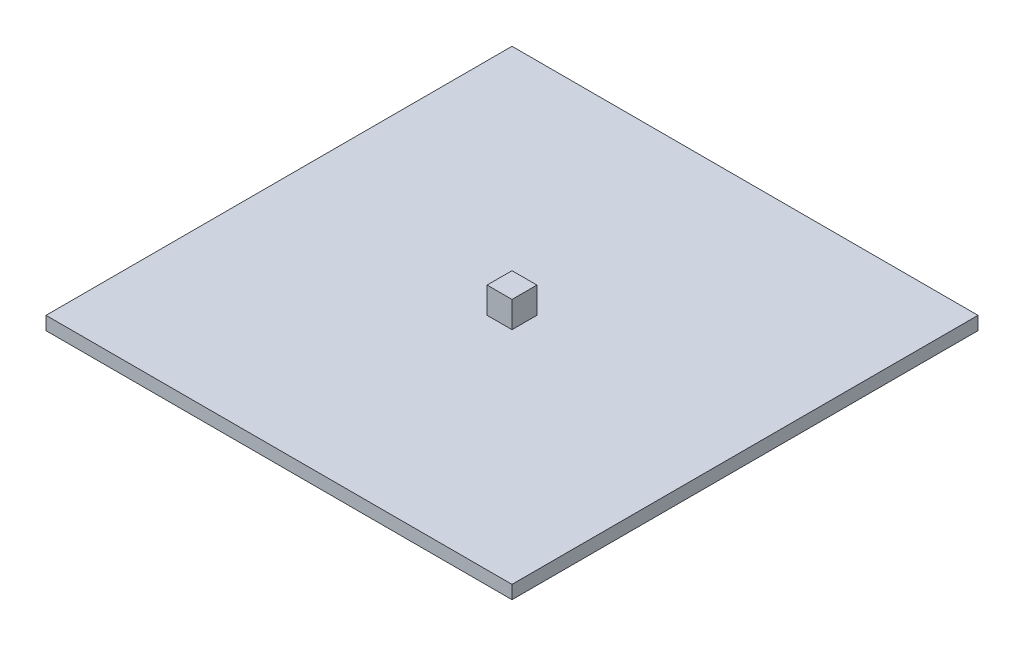
ISO-10303-21;
HEADER;
FILE_DESCRIPTION(('STEP AP214'),'2;1');
FILE_NAME('part.step','',(''),(''),'','','');
FILE_SCHEMA(('AUTOMOTIVE_DESIGN { 1 0 10303 214 1 1 1 1 }'));
ENDSEC;
DATA;
#1=APPLICATION_CONTEXT('core data for automotive mechanical design processes');
#2=APPLICATION_PROTOCOL_DEFINITION('international standard','automotive_design',2000,#1);
#3=PRODUCT_CONTEXT('',#1,'mechanical');
#4=PRODUCT('Part','Part','',(#3));
#5=PRODUCT_RELATED_PRODUCT_CATEGORY('part','',(#4));
#6=PRODUCT_DEFINITION_FORMATION('','',#4);
#7=PRODUCT_DEFINITION_CONTEXT('part definition',#1,'design');
#8=PRODUCT_DEFINITION('design','',#6,#7);
#9=PRODUCT_DEFINITION_SHAPE('','',#8);
#10=(LENGTH_UNIT() NAMED_UNIT(*) SI_UNIT(.MILLI.,.METRE.));
#11=(NAMED_UNIT(*) PLANE_ANGLE_UNIT() SI_UNIT($,.RADIAN.));
#12=(NAMED_UNIT(*) SI_UNIT($,.STERADIAN.) SOLID_ANGLE_UNIT());
#13=UNCERTAINTY_MEASURE_WITH_UNIT(LENGTH_MEASURE(1.E-05),#10,'distance_accuracy_value','');
#14=(GEOMETRIC_REPRESENTATION_CONTEXT(3) GLOBAL_UNCERTAINTY_ASSIGNED_CONTEXT((#13)) GLOBAL_UNIT_ASSIGNED_CONTEXT((#10,
#11,#12)) REPRESENTATION_CONTEXT('',''));
#15=CARTESIAN_POINT('',(0.,0.,0.));
#16=DIRECTION('',(0.,0.,1.));
#17=DIRECTION('',(1.,0.,0.));
#18=AXIS2_PLACEMENT_3D('',#15,#16,#17);
#19=CARTESIAN_POINT('',(0.,2.54,0.));
#20=DIRECTION('',(0.,-1.,0.));
#21=DIRECTION('',(0.,0.,-1.));
#22=AXIS2_PLACEMENT_3D('',#19,#20,#21);
#23=PLANE('',#22);
#24=DIRECTION('',(0.,0.,-1.));
#25=VECTOR('',#24,1.);
#26=CARTESIAN_POINT('',(44.45,2.54,44.45));
#27=LINE('',#26,#25);
#28=CARTESIAN_POINT('',(44.45,2.54,44.45));
#29=VERTEX_POINT('',#28);
#30=CARTESIAN_POINT('',(44.45,2.54,-44.45));
#31=VERTEX_POINT('',#30);
#32=EDGE_CURVE('E132',#29,#31,#27,.T.);
#33=ORIENTED_EDGE('',*,*,#32,.T.);
#34=DIRECTION('',(-1.,0.,0.));
#35=VECTOR('',#34,1.);
#36=CARTESIAN_POINT('',(-44.45,2.54,-44.45));
#37=LINE('',#36,#35);
#38=CARTESIAN_POINT('',(-44.45,2.54,-44.45));
#39=VERTEX_POINT('',#38);
#40=EDGE_CURVE('E135',#31,#39,#37,.T.);
#41=ORIENTED_EDGE('',*,*,#40,.T.);
#42=DIRECTION('',(0.,0.,1.));
#43=VECTOR('',#42,1.);
#44=CARTESIAN_POINT('',(-44.45,2.54,44.45));
#45=LINE('',#44,#43);
#46=CARTESIAN_POINT('',(-44.45,2.54,44.45));
#47=VERTEX_POINT('',#46);
#48=EDGE_CURVE('E138',#39,#47,#45,.T.);
#49=ORIENTED_EDGE('',*,*,#48,.T.);
#50=DIRECTION('',(1.,0.,0.));
#51=VECTOR('',#50,1.);
#52=CARTESIAN_POINT('',(-44.45,2.54,44.45));
#53=LINE('',#52,#51);
#54=EDGE_CURVE('E140',#47,#29,#53,.T.);
#55=ORIENTED_EDGE('',*,*,#54,.T.);
#56=EDGE_LOOP('',(#33,#41,#49,#55));
#57=FACE_BOUND('',#56,.T.);
#58=DIRECTION('',(-1.,0.,0.));
#59=VECTOR('',#58,1.);
#60=CARTESIAN_POINT('',(2.375,2.54,-2.375));
#61=LINE('',#60,#59);
#62=CARTESIAN_POINT('',(2.375,2.54,-2.375));
#63=VERTEX_POINT('',#62);
#64=CARTESIAN_POINT('',(-2.375,2.54,-2.375));
#65=VERTEX_POINT('',#64);
#66=EDGE_CURVE('E122',#63,#65,#61,.T.);
#67=ORIENTED_EDGE('',*,*,#66,.F.);
#68=DIRECTION('',(0.,0.,-1.));
#69=VECTOR('',#68,1.);
#70=CARTESIAN_POINT('',(2.375,2.54,2.375));
#71=LINE('',#70,#69);
#72=CARTESIAN_POINT('',(2.375,2.54,2.375));
#73=VERTEX_POINT('',#72);
#74=EDGE_CURVE('E119',#73,#63,#71,.T.);
#75=ORIENTED_EDGE('',*,*,#74,.F.);
#76=DIRECTION('',(1.,0.,0.));
#77=VECTOR('',#76,1.);
#78=CARTESIAN_POINT('',(2.375,2.54,2.375));
#79=LINE('',#78,#77);
#80=CARTESIAN_POINT('',(-2.375,2.54,2.375));
#81=VERTEX_POINT('',#80);
#82=EDGE_CURVE('E57',#81,#73,#79,.T.);
#83=ORIENTED_EDGE('',*,*,#82,.F.);
#84=DIRECTION('',(0.,0.,1.));
#85=VECTOR('',#84,1.);
#86=CARTESIAN_POINT('',(-2.375,2.54,2.375));
#87=LINE('',#86,#85);
#88=EDGE_CURVE('E52',#65,#81,#87,.T.);
#89=ORIENTED_EDGE('',*,*,#88,.F.);
#90=EDGE_LOOP('',(#67,#75,#83,#89));
#91=FACE_BOUND('',#90,.T.);
#92=ADVANCED_FACE('F37',(#57,#91),#23,.F.);
#93=CARTESIAN_POINT('',(44.45,2.54,44.45));
#94=DIRECTION('',(-1.,0.,0.));
#95=DIRECTION('',(0.,0.,1.));
#96=AXIS2_PLACEMENT_3D('',#93,#94,#95);
#97=PLANE('',#96);
#98=DIRECTION('',(0.,0.,-1.));
#99=VECTOR('',#98,1.);
#100=CARTESIAN_POINT('',(44.45,0.,44.45));
#101=LINE('',#100,#99);
#102=CARTESIAN_POINT('',(44.45,0.,44.45));
#103=VERTEX_POINT('',#102);
#104=CARTESIAN_POINT('',(44.45,0.,-44.45));
#105=VERTEX_POINT('',#104);
#106=EDGE_CURVE('E123',#103,#105,#101,.T.);
#107=ORIENTED_EDGE('',*,*,#106,.T.);
#108=DIRECTION('',(0.,-1.,0.));
#109=VECTOR('',#108,1.);
#110=CARTESIAN_POINT('',(44.45,2.54,-44.45));
#111=LINE('',#110,#109);
#112=EDGE_CURVE('E11',#31,#105,#111,.T.);
#113=ORIENTED_EDGE('',*,*,#112,.F.);
#114=ORIENTED_EDGE('',*,*,#32,.F.);
#115=DIRECTION('',(0.,-1.,0.));
#116=VECTOR('',#115,1.);
#117=CARTESIAN_POINT('',(44.45,2.54,44.45));
#118=LINE('',#117,#116);
#119=EDGE_CURVE('E141',#29,#103,#118,.T.);
#120=ORIENTED_EDGE('',*,*,#119,.T.);
#121=EDGE_LOOP('',(#107,#113,#114,#120));
#122=FACE_BOUND('',#121,.T.);
#123=ADVANCED_FACE('F39',(#122),#97,.F.);
#124=CARTESIAN_POINT('',(-44.45,2.54,-44.45));
#125=DIRECTION('',(0.,0.,1.));
#126=DIRECTION('',(1.,0.,0.));
#127=AXIS2_PLACEMENT_3D('',#124,#125,#126);
#128=PLANE('',#127);
#129=DIRECTION('',(-1.,0.,0.));
#130=VECTOR('',#129,1.);
#131=CARTESIAN_POINT('',(-44.45,0.,-44.45));
#132=LINE('',#131,#130);
#133=CARTESIAN_POINT('',(-44.45,0.,-44.45));
#134=VERTEX_POINT('',#133);
#135=EDGE_CURVE('E126',#105,#134,#132,.T.);
#136=ORIENTED_EDGE('',*,*,#135,.T.);
#137=DIRECTION('',(0.,-1.,0.));
#138=VECTOR('',#137,1.);
#139=CARTESIAN_POINT('',(-44.45,2.54,-44.45));
#140=LINE('',#139,#138);
#141=EDGE_CURVE('E45',#39,#134,#140,.T.);
#142=ORIENTED_EDGE('',*,*,#141,.F.);
#143=ORIENTED_EDGE('',*,*,#40,.F.);
#144=ORIENTED_EDGE('',*,*,#112,.T.);
#145=EDGE_LOOP('',(#136,#142,#143,#144));
#146=FACE_BOUND('',#145,.T.);
#147=ADVANCED_FACE('F171',(#146),#128,.F.);
#148=CARTESIAN_POINT('',(-44.45,2.54,44.45));
#149=DIRECTION('',(1.,0.,0.));
#150=DIRECTION('',(0.,0.,-1.));
#151=AXIS2_PLACEMENT_3D('',#148,#149,#150);
#152=PLANE('',#151);
#153=DIRECTION('',(0.,0.,1.));
#154=VECTOR('',#153,1.);
#155=CARTESIAN_POINT('',(-44.45,0.,44.45));
#156=LINE('',#155,#154);
#157=CARTESIAN_POINT('',(-44.45,0.,44.45));
#158=VERTEX_POINT('',#157);
#159=EDGE_CURVE('E144',#134,#158,#156,.T.);
#160=ORIENTED_EDGE('',*,*,#159,.T.);
#161=DIRECTION('',(0.,-1.,0.));
#162=VECTOR('',#161,1.);
#163=CARTESIAN_POINT('',(-44.45,2.54,44.45));
#164=LINE('',#163,#162);
#165=EDGE_CURVE('E149',#47,#158,#164,.T.);
#166=ORIENTED_EDGE('',*,*,#165,.F.);
#167=ORIENTED_EDGE('',*,*,#48,.F.);
#168=ORIENTED_EDGE('',*,*,#141,.T.);
#169=EDGE_LOOP('',(#160,#166,#167,#168));
#170=FACE_BOUND('',#169,.T.);
#171=ADVANCED_FACE('F156',(#170),#152,.F.);
#172=CARTESIAN_POINT('',(-44.45,2.54,44.45));
#173=DIRECTION('',(0.,0.,-1.));
#174=DIRECTION('',(-1.,0.,0.));
#175=AXIS2_PLACEMENT_3D('',#172,#173,#174);
#176=PLANE('',#175);
#177=DIRECTION('',(1.,0.,0.));
#178=VECTOR('',#177,1.);
#179=CARTESIAN_POINT('',(-44.45,0.,44.45));
#180=LINE('',#179,#178);
#181=EDGE_CURVE('E136',#158,#103,#180,.T.);
#182=ORIENTED_EDGE('',*,*,#181,.T.);
#183=ORIENTED_EDGE('',*,*,#119,.F.);
#184=ORIENTED_EDGE('',*,*,#54,.F.);
#185=ORIENTED_EDGE('',*,*,#165,.T.);
#186=EDGE_LOOP('',(#182,#183,#184,#185));
#187=FACE_BOUND('',#186,.T.);
#188=ADVANCED_FACE('F165',(#187),#176,.F.);
#189=CARTESIAN_POINT('',(0.,0.,0.));
#190=DIRECTION('',(0.,-1.,0.));
#191=DIRECTION('',(0.,0.,-1.));
#192=AXIS2_PLACEMENT_3D('',#189,#190,#191);
#193=PLANE('',#192);
#194=ORIENTED_EDGE('',*,*,#106,.F.);
#195=ORIENTED_EDGE('',*,*,#181,.F.);
#196=ORIENTED_EDGE('',*,*,#159,.F.);
#197=ORIENTED_EDGE('',*,*,#135,.F.);
#198=EDGE_LOOP('',(#194,#195,#196,#197));
#199=FACE_BOUND('',#198,.T.);
#200=ADVANCED_FACE('F162',(#199),#193,.T.);
#201=CARTESIAN_POINT('',(2.375,7.54,-2.375));
#202=DIRECTION('',(0.,0.,1.));
#203=DIRECTION('',(1.,0.,0.));
#204=AXIS2_PLACEMENT_3D('',#201,#202,#203);
#205=PLANE('',#204);
#206=ORIENTED_EDGE('',*,*,#66,.T.);
#207=DIRECTION('',(0.,-1.,0.));
#208=VECTOR('',#207,1.);
#209=CARTESIAN_POINT('',(-2.375,7.54,-2.375));
#210=LINE('',#209,#208);
#211=CARTESIAN_POINT('',(-2.375,7.54,-2.375));
#212=VERTEX_POINT('',#211);
#213=EDGE_CURVE('E103',#212,#65,#210,.T.);
#214=ORIENTED_EDGE('',*,*,#213,.F.);
#215=DIRECTION('',(-1.,0.,0.));
#216=VECTOR('',#215,1.);
#217=CARTESIAN_POINT('',(2.375,7.54,-2.375));
#218=LINE('',#217,#216);
#219=CARTESIAN_POINT('',(2.375,7.54,-2.375));
#220=VERTEX_POINT('',#219);
#221=EDGE_CURVE('E110',#220,#212,#218,.T.);
#222=ORIENTED_EDGE('',*,*,#221,.F.);
#223=DIRECTION('',(0.,-1.,0.));
#224=VECTOR('',#223,1.);
#225=CARTESIAN_POINT('',(2.375,7.54,-2.375));
#226=LINE('',#225,#224);
#227=EDGE_CURVE('E286',#220,#63,#226,.T.);
#228=ORIENTED_EDGE('',*,*,#227,.T.);
#229=EDGE_LOOP('',(#206,#214,#222,#228));
#230=FACE_BOUND('',#229,.T.);
#231=ADVANCED_FACE('F121',(#230),#205,.F.);
#232=CARTESIAN_POINT('',(-2.375,7.54,2.375));
#233=DIRECTION('',(1.,0.,0.));
#234=DIRECTION('',(0.,0.,-1.));
#235=AXIS2_PLACEMENT_3D('',#232,#233,#234);
#236=PLANE('',#235);
#237=ORIENTED_EDGE('',*,*,#88,.T.);
#238=DIRECTION('',(0.,-1.,0.));
#239=VECTOR('',#238,1.);
#240=CARTESIAN_POINT('',(-2.375,7.54,2.375));
#241=LINE('',#240,#239);
#242=CARTESIAN_POINT('',(-2.375,7.54,2.375));
#243=VERTEX_POINT('',#242);
#244=EDGE_CURVE('E106',#243,#81,#241,.T.);
#245=ORIENTED_EDGE('',*,*,#244,.F.);
#246=DIRECTION('',(0.,0.,1.));
#247=VECTOR('',#246,1.);
#248=CARTESIAN_POINT('',(-2.375,7.54,2.375));
#249=LINE('',#248,#247);
#250=EDGE_CURVE('E99',#212,#243,#249,.T.);
#251=ORIENTED_EDGE('',*,*,#250,.F.);
#252=ORIENTED_EDGE('',*,*,#213,.T.);
#253=EDGE_LOOP('',(#237,#245,#251,#252));
#254=FACE_BOUND('',#253,.T.);
#255=ADVANCED_FACE('F101',(#254),#236,.F.);
#256=CARTESIAN_POINT('',(2.375,7.54,2.375));
#257=DIRECTION('',(0.,0.,-1.));
#258=DIRECTION('',(-1.,0.,0.));
#259=AXIS2_PLACEMENT_3D('',#256,#257,#258);
#260=PLANE('',#259);
#261=ORIENTED_EDGE('',*,*,#82,.T.);
#262=DIRECTION('',(0.,-1.,0.));
#263=VECTOR('',#262,1.);
#264=CARTESIAN_POINT('',(2.375,7.54,2.375));
#265=LINE('',#264,#263);
#266=CARTESIAN_POINT('',(2.375,7.54,2.375));
#267=VERTEX_POINT('',#266);
#268=EDGE_CURVE('E128',#267,#73,#265,.T.);
#269=ORIENTED_EDGE('',*,*,#268,.F.);
#270=DIRECTION('',(1.,0.,0.));
#271=VECTOR('',#270,1.);
#272=CARTESIAN_POINT('',(2.375,7.54,2.375));
#273=LINE('',#272,#271);
#274=EDGE_CURVE('E109',#243,#267,#273,.T.);
#275=ORIENTED_EDGE('',*,*,#274,.F.);
#276=ORIENTED_EDGE('',*,*,#244,.T.);
#277=EDGE_LOOP('',(#261,#269,#275,#276));
#278=FACE_BOUND('',#277,.T.);
#279=ADVANCED_FACE('F207',(#278),#260,.F.);
#280=CARTESIAN_POINT('',(2.375,7.54,2.375));
#281=DIRECTION('',(-1.,0.,0.));
#282=DIRECTION('',(0.,0.,1.));
#283=AXIS2_PLACEMENT_3D('',#280,#281,#282);
#284=PLANE('',#283);
#285=ORIENTED_EDGE('',*,*,#74,.T.);
#286=ORIENTED_EDGE('',*,*,#227,.F.);
#287=DIRECTION('',(0.,0.,-1.));
#288=VECTOR('',#287,1.);
#289=CARTESIAN_POINT('',(2.375,7.54,2.375));
#290=LINE('',#289,#288);
#291=EDGE_CURVE('E115',#267,#220,#290,.T.);
#292=ORIENTED_EDGE('',*,*,#291,.F.);
#293=ORIENTED_EDGE('',*,*,#268,.T.);
#294=EDGE_LOOP('',(#285,#286,#292,#293));
#295=FACE_BOUND('',#294,.T.);
#296=ADVANCED_FACE('F213',(#295),#284,.F.);
#297=CARTESIAN_POINT('',(0.,7.54,0.));
#298=DIRECTION('',(0.,-1.,0.));
#299=DIRECTION('',(0.,0.,-1.));
#300=AXIS2_PLACEMENT_3D('',#297,#298,#299);
#301=PLANE('',#300);
#302=ORIENTED_EDGE('',*,*,#221,.T.);
#303=ORIENTED_EDGE('',*,*,#250,.T.);
#304=ORIENTED_EDGE('',*,*,#274,.T.);
#305=ORIENTED_EDGE('',*,*,#291,.T.);
#306=EDGE_LOOP('',(#302,#303,#304,#305));
#307=FACE_BOUND('',#306,.T.);
#308=ADVANCED_FACE('F113',(#307),#301,.F.);
#309=CLOSED_SHELL('',(#92,#123,#147,#171,#188,#200,#231,#255,#279,#296,#308));
#310=MANIFOLD_SOLID_BREP('B2',#309);
#311=ADVANCED_BREP_SHAPE_REPRESENTATION('',(#18,#310),#14);
#312=SHAPE_DEFINITION_REPRESENTATION(#9,#311);
ENDSEC;
END-ISO-10303-21;
